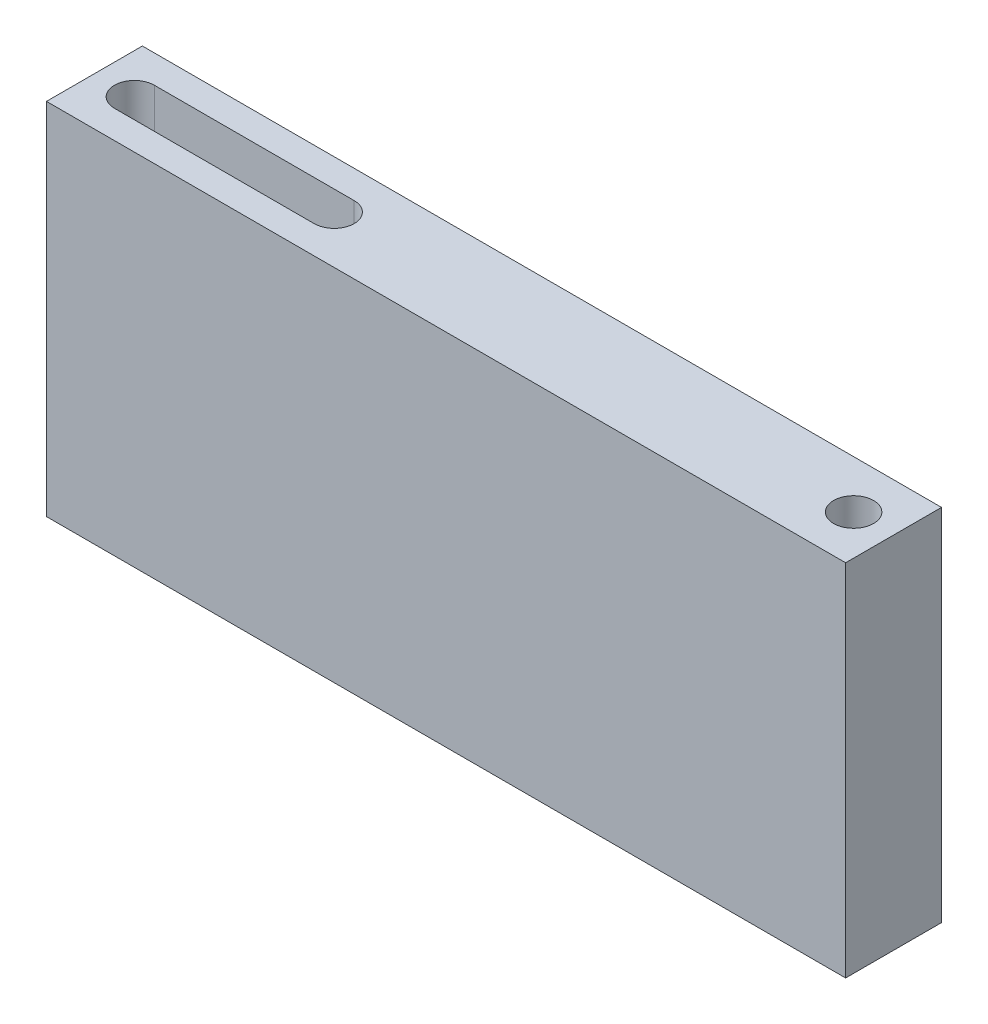
ISO-10303-21;
HEADER;
FILE_DESCRIPTION(('STEP AP214'),'2;1');
FILE_NAME('part.step','',(''),(''),'','','');
FILE_SCHEMA(('AUTOMOTIVE_DESIGN { 1 0 10303 214 1 1 1 1 }'));
ENDSEC;
DATA;
#1=APPLICATION_CONTEXT('core data for automotive mechanical design processes');
#2=APPLICATION_PROTOCOL_DEFINITION('international standard','automotive_design',2000,#1);
#3=PRODUCT_CONTEXT('',#1,'mechanical');
#4=PRODUCT('Part','Part','',(#3));
#5=PRODUCT_RELATED_PRODUCT_CATEGORY('part','',(#4));
#6=PRODUCT_DEFINITION_FORMATION('','',#4);
#7=PRODUCT_DEFINITION_CONTEXT('part definition',#1,'design');
#8=PRODUCT_DEFINITION('design','',#6,#7);
#9=PRODUCT_DEFINITION_SHAPE('','',#8);
#10=(LENGTH_UNIT() NAMED_UNIT(*) SI_UNIT(.MILLI.,.METRE.));
#11=(NAMED_UNIT(*) PLANE_ANGLE_UNIT() SI_UNIT($,.RADIAN.));
#12=(NAMED_UNIT(*) SI_UNIT($,.STERADIAN.) SOLID_ANGLE_UNIT());
#13=UNCERTAINTY_MEASURE_WITH_UNIT(LENGTH_MEASURE(1.E-05),#10,'distance_accuracy_value','');
#14=(GEOMETRIC_REPRESENTATION_CONTEXT(3) GLOBAL_UNCERTAINTY_ASSIGNED_CONTEXT((#13)) GLOBAL_UNIT_ASSIGNED_CONTEXT((#10,
#11,#12)) REPRESENTATION_CONTEXT('',''));
#15=CARTESIAN_POINT('',(0.,0.,0.));
#16=DIRECTION('',(0.,0.,1.));
#17=DIRECTION('',(1.,0.,0.));
#18=AXIS2_PLACEMENT_3D('',#15,#16,#17);
#19=CARTESIAN_POINT('',(0.,0.,12.));
#20=DIRECTION('',(-1.,0.,0.));
#21=DIRECTION('',(0.,0.,1.));
#22=AXIS2_PLACEMENT_3D('',#19,#20,#21);
#23=PLANE('',#22);
#24=DIRECTION('',(0.,1.,0.));
#25=VECTOR('',#24,1.);
#26=CARTESIAN_POINT('',(0.,0.,0.));
#27=LINE('',#26,#25);
#28=CARTESIAN_POINT('',(0.,0.,0.));
#29=VERTEX_POINT('',#28);
#30=CARTESIAN_POINT('',(0.,45.,0.));
#31=VERTEX_POINT('',#30);
#32=EDGE_CURVE('E139',#29,#31,#27,.T.);
#33=ORIENTED_EDGE('',*,*,#32,.F.);
#34=DIRECTION('',(0.,0.,-1.));
#35=VECTOR('',#34,1.);
#36=CARTESIAN_POINT('',(0.,0.,12.));
#37=LINE('',#36,#35);
#38=CARTESIAN_POINT('',(0.,0.,12.));
#39=VERTEX_POINT('',#38);
#40=EDGE_CURVE('E11',#39,#29,#37,.T.);
#41=ORIENTED_EDGE('',*,*,#40,.F.);
#42=DIRECTION('',(0.,1.,0.));
#43=VECTOR('',#42,1.);
#44=CARTESIAN_POINT('',(0.,0.,12.));
#45=LINE('',#44,#43);
#46=CARTESIAN_POINT('',(0.,45.,12.));
#47=VERTEX_POINT('',#46);
#48=EDGE_CURVE('E150',#39,#47,#45,.T.);
#49=ORIENTED_EDGE('',*,*,#48,.T.);
#50=DIRECTION('',(0.,0.,-1.));
#51=VECTOR('',#50,1.);
#52=CARTESIAN_POINT('',(0.,45.,12.));
#53=LINE('',#52,#51);
#54=EDGE_CURVE('E45',#47,#31,#53,.T.);
#55=ORIENTED_EDGE('',*,*,#54,.T.);
#56=EDGE_LOOP('',(#33,#41,#49,#55));
#57=FACE_BOUND('',#56,.T.);
#58=ADVANCED_FACE('F39',(#57),#23,.T.);
#59=CARTESIAN_POINT('',(0.,0.,12.));
#60=DIRECTION('',(0.,1.,0.));
#61=DIRECTION('',(0.,0.,1.));
#62=AXIS2_PLACEMENT_3D('',#59,#60,#61);
#63=PLANE('',#62);
#64=DIRECTION('',(-1.,0.,0.));
#65=VECTOR('',#64,1.);
#66=CARTESIAN_POINT('',(30.,0.,8.49999999999999));
#67=LINE('',#66,#65);
#68=CARTESIAN_POINT('',(30.,0.,8.49999999999999));
#69=VERTEX_POINT('',#68);
#70=CARTESIAN_POINT('',(5.,0.,8.5));
#71=VERTEX_POINT('',#70);
#72=EDGE_CURVE('E132',#69,#71,#67,.T.);
#73=ORIENTED_EDGE('',*,*,#72,.F.);
#74=CARTESIAN_POINT('',(30.,0.,6.));
#75=DIRECTION('',(0.,-1.,0.));
#76=DIRECTION('',(0.,0.,-1.));
#77=AXIS2_PLACEMENT_3D('',#74,#75,#76);
#78=CIRCLE('',#77,2.5);
#79=CARTESIAN_POINT('',(30.,0.,3.5));
#80=VERTEX_POINT('',#79);
#81=EDGE_CURVE('E54',#80,#69,#78,.T.);
#82=ORIENTED_EDGE('',*,*,#81,.F.);
#83=DIRECTION('',(1.,0.,0.));
#84=VECTOR('',#83,1.);
#85=CARTESIAN_POINT('',(30.,0.,3.5));
#86=LINE('',#85,#84);
#87=CARTESIAN_POINT('',(5.,0.,3.5));
#88=VERTEX_POINT('',#87);
#89=EDGE_CURVE('E125',#88,#80,#86,.T.);
#90=ORIENTED_EDGE('',*,*,#89,.F.);
#91=CARTESIAN_POINT('',(5.,0.,6.));
#92=DIRECTION('',(0.,-1.,0.));
#93=DIRECTION('',(0.,0.,-1.));
#94=AXIS2_PLACEMENT_3D('',#91,#92,#93);
#95=CIRCLE('',#94,2.5);
#96=EDGE_CURVE('E123',#71,#88,#95,.T.);
#97=ORIENTED_EDGE('',*,*,#96,.F.);
#98=EDGE_LOOP('',(#73,#82,#90,#97));
#99=FACE_BOUND('',#98,.T.);
#100=CARTESIAN_POINT('',(95.,0.,6.));
#101=DIRECTION('',(0.,-1.,0.));
#102=DIRECTION('',(0.,0.,-1.));
#103=AXIS2_PLACEMENT_3D('',#100,#101,#102);
#104=CIRCLE('',#103,2.5);
#105=CARTESIAN_POINT('',(95.,0.,3.5));
#106=VERTEX_POINT('',#105);
#107=EDGE_CURVE('E135',#106,#106,#104,.T.);
#108=ORIENTED_EDGE('',*,*,#107,.F.);
#109=EDGE_LOOP('',(#108));
#110=FACE_BOUND('',#109,.T.);
#111=DIRECTION('',(1.,0.,0.));
#112=VECTOR('',#111,1.);
#113=CARTESIAN_POINT('',(0.,0.,0.));
#114=LINE('',#113,#112);
#115=CARTESIAN_POINT('',(100.,0.,0.));
#116=VERTEX_POINT('',#115);
#117=EDGE_CURVE('E151',#29,#116,#114,.T.);
#118=ORIENTED_EDGE('',*,*,#117,.T.);
#119=DIRECTION('',(0.,0.,-1.));
#120=VECTOR('',#119,1.);
#121=CARTESIAN_POINT('',(100.,0.,12.));
#122=LINE('',#121,#120);
#123=CARTESIAN_POINT('',(100.,0.,12.));
#124=VERTEX_POINT('',#123);
#125=EDGE_CURVE('E50',#124,#116,#122,.T.);
#126=ORIENTED_EDGE('',*,*,#125,.F.);
#127=DIRECTION('',(1.,0.,0.));
#128=VECTOR('',#127,1.);
#129=CARTESIAN_POINT('',(0.,0.,12.));
#130=LINE('',#129,#128);
#131=EDGE_CURVE('E156',#39,#124,#130,.T.);
#132=ORIENTED_EDGE('',*,*,#131,.F.);
#133=ORIENTED_EDGE('',*,*,#40,.T.);
#134=EDGE_LOOP('',(#118,#126,#132,#133));
#135=FACE_BOUND('',#134,.T.);
#136=ADVANCED_FACE('F185',(#99,#110,#135),#63,.F.);
#137=CARTESIAN_POINT('',(100.,0.,12.));
#138=DIRECTION('',(-1.,0.,0.));
#139=DIRECTION('',(0.,0.,1.));
#140=AXIS2_PLACEMENT_3D('',#137,#138,#139);
#141=PLANE('',#140);
#142=DIRECTION('',(0.,1.,0.));
#143=VECTOR('',#142,1.);
#144=CARTESIAN_POINT('',(100.,0.,0.));
#145=LINE('',#144,#143);
#146=CARTESIAN_POINT('',(100.,45.,0.));
#147=VERTEX_POINT('',#146);
#148=EDGE_CURVE('E162',#116,#147,#145,.T.);
#149=ORIENTED_EDGE('',*,*,#148,.T.);
#150=DIRECTION('',(0.,0.,-1.));
#151=VECTOR('',#150,1.);
#152=CARTESIAN_POINT('',(100.,45.,12.));
#153=LINE('',#152,#151);
#154=CARTESIAN_POINT('',(100.,45.,12.));
#155=VERTEX_POINT('',#154);
#156=EDGE_CURVE('E169',#155,#147,#153,.T.);
#157=ORIENTED_EDGE('',*,*,#156,.F.);
#158=DIRECTION('',(0.,1.,0.));
#159=VECTOR('',#158,1.);
#160=CARTESIAN_POINT('',(100.,0.,12.));
#161=LINE('',#160,#159);
#162=EDGE_CURVE('E152',#124,#155,#161,.T.);
#163=ORIENTED_EDGE('',*,*,#162,.F.);
#164=ORIENTED_EDGE('',*,*,#125,.T.);
#165=EDGE_LOOP('',(#149,#157,#163,#164));
#166=FACE_BOUND('',#165,.T.);
#167=ADVANCED_FACE('F187',(#166),#141,.F.);
#168=CARTESIAN_POINT('',(0.,45.,12.));
#169=DIRECTION('',(0.,1.,0.));
#170=DIRECTION('',(0.,0.,1.));
#171=AXIS2_PLACEMENT_3D('',#168,#169,#170);
#172=PLANE('',#171);
#173=CARTESIAN_POINT('',(30.,45.,6.));
#174=DIRECTION('',(0.,-1.,0.));
#175=DIRECTION('',(0.,0.,-1.));
#176=AXIS2_PLACEMENT_3D('',#173,#174,#175);
#177=CIRCLE('',#176,2.5);
#178=CARTESIAN_POINT('',(30.,45.,3.5));
#179=VERTEX_POINT('',#178);
#180=CARTESIAN_POINT('',(30.,45.,8.49999999999999));
#181=VERTEX_POINT('',#180);
#182=EDGE_CURVE('E106',#179,#181,#177,.T.);
#183=ORIENTED_EDGE('',*,*,#182,.T.);
#184=DIRECTION('',(-1.,0.,0.));
#185=VECTOR('',#184,1.);
#186=CARTESIAN_POINT('',(30.,45.,8.49999999999999));
#187=LINE('',#186,#185);
#188=CARTESIAN_POINT('',(5.,45.,8.49999999999999));
#189=VERTEX_POINT('',#188);
#190=EDGE_CURVE('E113',#181,#189,#187,.T.);
#191=ORIENTED_EDGE('',*,*,#190,.T.);
#192=CARTESIAN_POINT('',(5.,45.,6.));
#193=DIRECTION('',(0.,-1.,0.));
#194=DIRECTION('',(0.,0.,-1.));
#195=AXIS2_PLACEMENT_3D('',#192,#193,#194);
#196=CIRCLE('',#195,2.5);
#197=CARTESIAN_POINT('',(5.,45.,3.5));
#198=VERTEX_POINT('',#197);
#199=EDGE_CURVE('E64',#189,#198,#196,.T.);
#200=ORIENTED_EDGE('',*,*,#199,.T.);
#201=DIRECTION('',(1.,0.,0.));
#202=VECTOR('',#201,1.);
#203=CARTESIAN_POINT('',(30.,45.,3.5));
#204=LINE('',#203,#202);
#205=EDGE_CURVE('E115',#198,#179,#204,.T.);
#206=ORIENTED_EDGE('',*,*,#205,.T.);
#207=EDGE_LOOP('',(#183,#191,#200,#206));
#208=FACE_BOUND('',#207,.T.);
#209=CARTESIAN_POINT('',(95.,45.,6.));
#210=DIRECTION('',(0.,-1.,0.));
#211=DIRECTION('',(0.,0.,-1.));
#212=AXIS2_PLACEMENT_3D('',#209,#210,#211);
#213=CIRCLE('',#212,2.5);
#214=CARTESIAN_POINT('',(95.,45.,3.5));
#215=VERTEX_POINT('',#214);
#216=EDGE_CURVE('E145',#215,#215,#213,.T.);
#217=ORIENTED_EDGE('',*,*,#216,.T.);
#218=EDGE_LOOP('',(#217));
#219=FACE_BOUND('',#218,.T.);
#220=DIRECTION('',(1.,0.,0.));
#221=VECTOR('',#220,1.);
#222=CARTESIAN_POINT('',(0.,45.,0.));
#223=LINE('',#222,#221);
#224=EDGE_CURVE('E159',#31,#147,#223,.T.);
#225=ORIENTED_EDGE('',*,*,#224,.F.);
#226=ORIENTED_EDGE('',*,*,#54,.F.);
#227=DIRECTION('',(1.,0.,0.));
#228=VECTOR('',#227,1.);
#229=CARTESIAN_POINT('',(0.,45.,12.));
#230=LINE('',#229,#228);
#231=EDGE_CURVE('E147',#47,#155,#230,.T.);
#232=ORIENTED_EDGE('',*,*,#231,.T.);
#233=ORIENTED_EDGE('',*,*,#156,.T.);
#234=EDGE_LOOP('',(#225,#226,#232,#233));
#235=FACE_BOUND('',#234,.T.);
#236=ADVANCED_FACE('F116',(#208,#219,#235),#172,.T.);
#237=CARTESIAN_POINT('',(0.,0.,12.));
#238=DIRECTION('',(0.,0.,-1.));
#239=DIRECTION('',(-1.,0.,0.));
#240=AXIS2_PLACEMENT_3D('',#237,#238,#239);
#241=PLANE('',#240);
#242=ORIENTED_EDGE('',*,*,#48,.F.);
#243=ORIENTED_EDGE('',*,*,#131,.T.);
#244=ORIENTED_EDGE('',*,*,#162,.T.);
#245=ORIENTED_EDGE('',*,*,#231,.F.);
#246=EDGE_LOOP('',(#242,#243,#244,#245));
#247=FACE_BOUND('',#246,.T.);
#248=ADVANCED_FACE('F189',(#247),#241,.F.);
#249=CARTESIAN_POINT('',(0.,0.,0.));
#250=DIRECTION('',(0.,0.,-1.));
#251=DIRECTION('',(-1.,0.,0.));
#252=AXIS2_PLACEMENT_3D('',#249,#250,#251);
#253=PLANE('',#252);
#254=ORIENTED_EDGE('',*,*,#32,.T.);
#255=ORIENTED_EDGE('',*,*,#224,.T.);
#256=ORIENTED_EDGE('',*,*,#148,.F.);
#257=ORIENTED_EDGE('',*,*,#117,.F.);
#258=EDGE_LOOP('',(#254,#255,#256,#257));
#259=FACE_BOUND('',#258,.T.);
#260=ADVANCED_FACE('F176',(#259),#253,.T.);
#261=CARTESIAN_POINT('',(95.,45.,6.));
#262=DIRECTION('',(0.,-1.,0.));
#263=DIRECTION('',(0.,0.,-1.));
#264=AXIS2_PLACEMENT_3D('',#261,#262,#263);
#265=CYLINDRICAL_SURFACE('',#264,2.5);
#266=CARTESIAN_POINT('',(95.,45.,3.5));
#267=CARTESIAN_POINT('',(95.,44.53125,3.5));
#268=CARTESIAN_POINT('',(95.,44.0625,3.5));
#269=CARTESIAN_POINT('',(95.,43.125,3.5));
#270=CARTESIAN_POINT('',(95.,42.65625,3.5));
#271=CARTESIAN_POINT('',(95.,41.71875,3.5));
#272=CARTESIAN_POINT('',(95.,41.25,3.5));
#273=CARTESIAN_POINT('',(95.,40.3125,3.5));
#274=CARTESIAN_POINT('',(95.,39.84375,3.5));
#275=CARTESIAN_POINT('',(95.,38.90625,3.5));
#276=CARTESIAN_POINT('',(95.,38.4375,3.5));
#277=CARTESIAN_POINT('',(95.,37.5,3.5));
#278=CARTESIAN_POINT('',(95.,37.03125,3.5));
#279=CARTESIAN_POINT('',(95.,36.09375,3.5));
#280=CARTESIAN_POINT('',(95.,35.625,3.5));
#281=CARTESIAN_POINT('',(95.,34.6875,3.5));
#282=CARTESIAN_POINT('',(95.,34.21875,3.5));
#283=CARTESIAN_POINT('',(95.,33.28125,3.5));
#284=CARTESIAN_POINT('',(95.,32.8125,3.5));
#285=CARTESIAN_POINT('',(95.,31.875,3.5));
#286=CARTESIAN_POINT('',(95.,31.40625,3.5));
#287=CARTESIAN_POINT('',(95.,30.46875,3.5));
#288=CARTESIAN_POINT('',(95.,30.,3.5));
#289=CARTESIAN_POINT('',(95.,29.0625,3.5));
#290=CARTESIAN_POINT('',(95.,28.59375,3.5));
#291=CARTESIAN_POINT('',(95.,27.65625,3.5));
#292=CARTESIAN_POINT('',(95.,27.1875,3.5));
#293=CARTESIAN_POINT('',(95.,26.25,3.5));
#294=CARTESIAN_POINT('',(95.,25.78125,3.5));
#295=CARTESIAN_POINT('',(95.,24.84375,3.5));
#296=CARTESIAN_POINT('',(95.,24.375,3.5));
#297=CARTESIAN_POINT('',(95.,23.4375,3.5));
#298=CARTESIAN_POINT('',(95.,22.96875,3.5));
#299=CARTESIAN_POINT('',(95.,22.03125,3.5));
#300=CARTESIAN_POINT('',(95.,21.5625,3.5));
#301=CARTESIAN_POINT('',(95.,20.625,3.5));
#302=CARTESIAN_POINT('',(95.,20.15625,3.5));
#303=CARTESIAN_POINT('',(95.,19.21875,3.5));
#304=CARTESIAN_POINT('',(95.,18.75,3.5));
#305=CARTESIAN_POINT('',(95.,17.8125,3.5));
#306=CARTESIAN_POINT('',(95.,17.34375,3.5));
#307=CARTESIAN_POINT('',(95.,16.40625,3.5));
#308=CARTESIAN_POINT('',(95.,15.9375,3.5));
#309=CARTESIAN_POINT('',(95.,15.,3.5));
#310=CARTESIAN_POINT('',(95.,14.53125,3.5));
#311=CARTESIAN_POINT('',(95.,13.59375,3.5));
#312=CARTESIAN_POINT('',(95.,13.125,3.5));
#313=CARTESIAN_POINT('',(95.,12.1875,3.5));
#314=CARTESIAN_POINT('',(95.,11.71875,3.5));
#315=CARTESIAN_POINT('',(95.,10.78125,3.5));
#316=CARTESIAN_POINT('',(95.,10.3125,3.5));
#317=CARTESIAN_POINT('',(95.,9.37500000000001,3.5));
#318=CARTESIAN_POINT('',(95.,8.90625000000001,3.5));
#319=CARTESIAN_POINT('',(95.,7.96875000000001,3.5));
#320=CARTESIAN_POINT('',(95.,7.50000000000001,3.5));
#321=CARTESIAN_POINT('',(95.,6.56250000000001,3.5));
#322=CARTESIAN_POINT('',(95.,6.09375000000001,3.5));
#323=CARTESIAN_POINT('',(95.,5.15625000000001,3.5));
#324=CARTESIAN_POINT('',(95.,4.68750000000001,3.5));
#325=CARTESIAN_POINT('',(95.,3.75000000000001,3.5));
#326=CARTESIAN_POINT('',(95.,3.28125000000001,3.5));
#327=CARTESIAN_POINT('',(95.,2.34375000000001,3.5));
#328=CARTESIAN_POINT('',(95.,1.87500000000001,3.5));
#329=CARTESIAN_POINT('',(95.,0.937500000000006,3.5));
#330=CARTESIAN_POINT('',(95.,0.468750000000007,3.5));
#331=CARTESIAN_POINT('',(95.,0.,3.5));
#332=B_SPLINE_CURVE_WITH_KNOTS('',3,(#266,#267,#268,#269,#270,#271,#272,#273,#274,#275,#276,
#277,#278,#279,#280,#281,#282,#283,#284,#285,#286,#287,#288,#289,#290,#291,#292,#293,#294,#295,
#296,#297,#298,#299,#300,#301,#302,#303,#304,#305,#306,#307,#308,#309,#310,#311,#312,#313,#314,
#315,#316,#317,#318,#319,#320,#321,#322,#323,#324,#325,#326,#327,#328,#329,#330,#331),
.UNSPECIFIED.,.F.,.F.,(4,2,2,2,2,2,2,2,2,2,2,2,2,2,2,2,2,2,2,2,2,2,2,2,2,2,2,2,2,2,2,2,4),(0.,
1.40625,2.8125,4.21875,5.62500000000001,7.03125,8.4375,9.84375000000001,11.25,12.65625,14.0625,
15.46875,16.875,18.28125,19.6875,21.09375,22.5,23.90625,25.3125,26.71875,28.125,29.53125,
30.9375,32.34375,33.75,35.15625,36.5625,37.96875,39.375,40.78125,42.1875,43.59375,45.),.UNSPECIFIED.);
#333=EDGE_CURVE('BSEAM193',#215,#106,#332,.T.);
#334=ORIENTED_EDGE('',*,*,#216,.F.);
#335=ORIENTED_EDGE('',*,*,#107,.T.);
#336=ORIENTED_EDGE('',*,*,#333,.T.);
#337=ORIENTED_EDGE('',*,*,#333,.F.);
#338=EDGE_LOOP('',(#334,#336,#335,#337));
#339=FACE_BOUND('',#338,.T.);
#340=ADVANCED_FACE('F193',(#339),#265,.F.);
#341=CARTESIAN_POINT('',(30.,45.,6.));
#342=DIRECTION('',(0.,-1.,0.));
#343=DIRECTION('',(0.,0.,-1.));
#344=AXIS2_PLACEMENT_3D('',#341,#342,#343);
#345=CYLINDRICAL_SURFACE('',#344,2.5);
#346=ORIENTED_EDGE('',*,*,#81,.T.);
#347=DIRECTION('',(0.,-1.,0.));
#348=VECTOR('',#347,1.);
#349=CARTESIAN_POINT('',(30.,45.,8.49999999999999));
#350=LINE('',#349,#348);
#351=EDGE_CURVE('E105',#181,#69,#350,.T.);
#352=ORIENTED_EDGE('',*,*,#351,.F.);
#353=ORIENTED_EDGE('',*,*,#182,.F.);
#354=DIRECTION('',(0.,-1.,0.));
#355=VECTOR('',#354,1.);
#356=CARTESIAN_POINT('',(30.,45.,3.5));
#357=LINE('',#356,#355);
#358=EDGE_CURVE('E137',#179,#80,#357,.T.);
#359=ORIENTED_EDGE('',*,*,#358,.T.);
#360=EDGE_LOOP('',(#346,#352,#353,#359));
#361=FACE_BOUND('',#360,.T.);
#362=ADVANCED_FACE('F102',(#361),#345,.F.);
#363=CARTESIAN_POINT('',(30.,45.,3.5));
#364=DIRECTION('',(0.,0.,-1.));
#365=DIRECTION('',(-1.,0.,0.));
#366=AXIS2_PLACEMENT_3D('',#363,#364,#365);
#367=PLANE('',#366);
#368=ORIENTED_EDGE('',*,*,#89,.T.);
#369=ORIENTED_EDGE('',*,*,#358,.F.);
#370=ORIENTED_EDGE('',*,*,#205,.F.);
#371=DIRECTION('',(0.,-1.,0.));
#372=VECTOR('',#371,1.);
#373=CARTESIAN_POINT('',(5.,45.,3.5));
#374=LINE('',#373,#372);
#375=EDGE_CURVE('E136',#198,#88,#374,.T.);
#376=ORIENTED_EDGE('',*,*,#375,.T.);
#377=EDGE_LOOP('',(#368,#369,#370,#376));
#378=FACE_BOUND('',#377,.T.);
#379=ADVANCED_FACE('F220',(#378),#367,.F.);
#380=CARTESIAN_POINT('',(5.,45.,6.));
#381=DIRECTION('',(0.,-1.,0.));
#382=DIRECTION('',(0.,0.,-1.));
#383=AXIS2_PLACEMENT_3D('',#380,#381,#382);
#384=CYLINDRICAL_SURFACE('',#383,2.5);
#385=ORIENTED_EDGE('',*,*,#96,.T.);
#386=ORIENTED_EDGE('',*,*,#375,.F.);
#387=ORIENTED_EDGE('',*,*,#199,.F.);
#388=DIRECTION('',(0.,-1.,0.));
#389=VECTOR('',#388,1.);
#390=CARTESIAN_POINT('',(5.,45.,8.5));
#391=LINE('',#390,#389);
#392=EDGE_CURVE('E112',#189,#71,#391,.T.);
#393=ORIENTED_EDGE('',*,*,#392,.T.);
#394=EDGE_LOOP('',(#385,#386,#387,#393));
#395=FACE_BOUND('',#394,.T.);
#396=ADVANCED_FACE('F224',(#395),#384,.F.);
#397=CARTESIAN_POINT('',(30.,45.,8.49999999999999));
#398=DIRECTION('',(0.,0.,1.));
#399=DIRECTION('',(1.,0.,0.));
#400=AXIS2_PLACEMENT_3D('',#397,#398,#399);
#401=PLANE('',#400);
#402=ORIENTED_EDGE('',*,*,#72,.T.);
#403=ORIENTED_EDGE('',*,*,#392,.F.);
#404=ORIENTED_EDGE('',*,*,#190,.F.);
#405=ORIENTED_EDGE('',*,*,#351,.T.);
#406=EDGE_LOOP('',(#402,#403,#404,#405));
#407=FACE_BOUND('',#406,.T.);
#408=ADVANCED_FACE('F117',(#407),#401,.F.);
#409=CLOSED_SHELL('',(#58,#136,#167,#236,#248,#260,#340,#362,#379,#396,#408));
#410=MANIFOLD_SOLID_BREP('B2',#409);
#411=ADVANCED_BREP_SHAPE_REPRESENTATION('',(#18,#410),#14);
#412=SHAPE_DEFINITION_REPRESENTATION(#9,#411);
ENDSEC;
END-ISO-10303-21;
